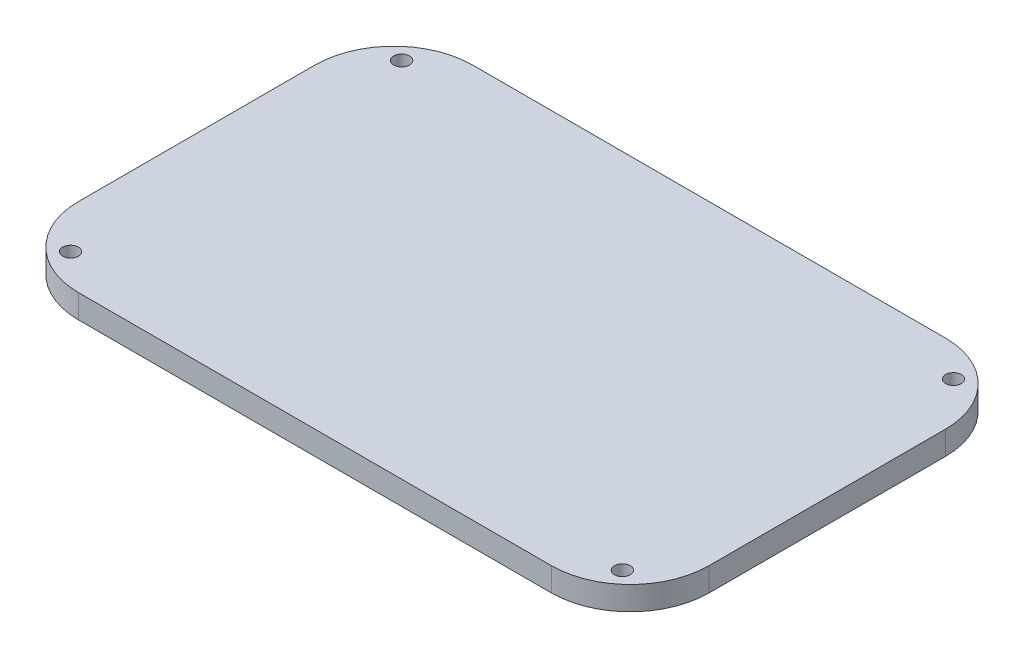
ISO-10303-21;
HEADER;
FILE_DESCRIPTION(('STEP AP214'),'2;1');
FILE_NAME('part.step','',(''),(''),'','','');
FILE_SCHEMA(('AUTOMOTIVE_DESIGN { 1 0 10303 214 1 1 1 1 }'));
ENDSEC;
DATA;
#1=APPLICATION_CONTEXT('core data for automotive mechanical design processes');
#2=APPLICATION_PROTOCOL_DEFINITION('international standard','automotive_design',2000,#1);
#3=PRODUCT_CONTEXT('',#1,'mechanical');
#4=PRODUCT('Part','Part','',(#3));
#5=PRODUCT_RELATED_PRODUCT_CATEGORY('part','',(#4));
#6=PRODUCT_DEFINITION_FORMATION('','',#4);
#7=PRODUCT_DEFINITION_CONTEXT('part definition',#1,'design');
#8=PRODUCT_DEFINITION('design','',#6,#7);
#9=PRODUCT_DEFINITION_SHAPE('','',#8);
#10=(LENGTH_UNIT() NAMED_UNIT(*) SI_UNIT(.MILLI.,.METRE.));
#11=(NAMED_UNIT(*) PLANE_ANGLE_UNIT() SI_UNIT($,.RADIAN.));
#12=(NAMED_UNIT(*) SI_UNIT($,.STERADIAN.) SOLID_ANGLE_UNIT());
#13=UNCERTAINTY_MEASURE_WITH_UNIT(LENGTH_MEASURE(1.E-05),#10,'distance_accuracy_value','');
#14=(GEOMETRIC_REPRESENTATION_CONTEXT(3) GLOBAL_UNCERTAINTY_ASSIGNED_CONTEXT((#13)) GLOBAL_UNIT_ASSIGNED_CONTEXT((#10,
#11,#12)) REPRESENTATION_CONTEXT('',''));
#15=CARTESIAN_POINT('',(0.,0.,0.));
#16=DIRECTION('',(0.,0.,1.));
#17=DIRECTION('',(1.,0.,0.));
#18=AXIS2_PLACEMENT_3D('',#15,#16,#17);
#19=CARTESIAN_POINT('',(-40.,3.,-25.));
#20=DIRECTION('',(1.,0.,0.));
#21=DIRECTION('',(0.,0.,-1.));
#22=AXIS2_PLACEMENT_3D('',#19,#20,#21);
#23=PLANE('',#22);
#24=DIRECTION('',(0.,0.,1.));
#25=VECTOR('',#24,1.);
#26=CARTESIAN_POINT('',(-40.,3.,-25.));
#27=LINE('',#26,#25);
#28=CARTESIAN_POINT('',(-40.,3.,-15.));
#29=VERTEX_POINT('',#28);
#30=CARTESIAN_POINT('',(-40.,3.,15.));
#31=VERTEX_POINT('',#30);
#32=EDGE_CURVE('E127',#29,#31,#27,.T.);
#33=ORIENTED_EDGE('',*,*,#32,.F.);
#34=DIRECTION('',(0.,-1.,0.));
#35=VECTOR('',#34,1.);
#36=CARTESIAN_POINT('',(-40.,3.,-15.));
#37=LINE('',#36,#35);
#38=CARTESIAN_POINT('',(-40.,0.,-15.));
#39=VERTEX_POINT('',#38);
#40=EDGE_CURVE('E112',#29,#39,#37,.T.);
#41=ORIENTED_EDGE('',*,*,#40,.T.);
#42=DIRECTION('',(0.,0.,1.));
#43=VECTOR('',#42,1.);
#44=CARTESIAN_POINT('',(-40.,0.,-25.));
#45=LINE('',#44,#43);
#46=CARTESIAN_POINT('',(-40.,0.,15.));
#47=VERTEX_POINT('',#46);
#48=EDGE_CURVE('E124',#39,#47,#45,.T.);
#49=ORIENTED_EDGE('',*,*,#48,.T.);
#50=DIRECTION('',(0.,-1.,0.));
#51=VECTOR('',#50,1.);
#52=CARTESIAN_POINT('',(-40.,3.,15.));
#53=LINE('',#52,#51);
#54=EDGE_CURVE('E126',#47,#31,#53,.F.);
#55=ORIENTED_EDGE('',*,*,#54,.T.);
#56=EDGE_LOOP('',(#33,#41,#49,#55));
#57=FACE_BOUND('',#56,.T.);
#58=ADVANCED_FACE('F39',(#57),#23,.F.);
#59=CARTESIAN_POINT('',(40.,3.,25.));
#60=DIRECTION('',(0.,0.,-1.));
#61=DIRECTION('',(-1.,0.,0.));
#62=AXIS2_PLACEMENT_3D('',#59,#60,#61);
#63=PLANE('',#62);
#64=DIRECTION('',(1.,0.,0.));
#65=VECTOR('',#64,1.);
#66=CARTESIAN_POINT('',(40.,0.,25.));
#67=LINE('',#66,#65);
#68=CARTESIAN_POINT('',(-30.,0.,25.));
#69=VERTEX_POINT('',#68);
#70=CARTESIAN_POINT('',(30.,0.,25.));
#71=VERTEX_POINT('',#70);
#72=EDGE_CURVE('E135',#69,#71,#67,.T.);
#73=ORIENTED_EDGE('',*,*,#72,.T.);
#74=DIRECTION('',(0.,-1.,0.));
#75=VECTOR('',#74,1.);
#76=CARTESIAN_POINT('',(30.,3.,25.));
#77=LINE('',#76,#75);
#78=CARTESIAN_POINT('',(30.,3.,25.));
#79=VERTEX_POINT('',#78);
#80=EDGE_CURVE('E11',#71,#79,#77,.F.);
#81=ORIENTED_EDGE('',*,*,#80,.T.);
#82=DIRECTION('',(1.,0.,0.));
#83=VECTOR('',#82,1.);
#84=CARTESIAN_POINT('',(40.,3.,25.));
#85=LINE('',#84,#83);
#86=CARTESIAN_POINT('',(-30.,3.,25.));
#87=VERTEX_POINT('',#86);
#88=EDGE_CURVE('E206',#87,#79,#85,.T.);
#89=ORIENTED_EDGE('',*,*,#88,.F.);
#90=DIRECTION('',(0.,-1.,0.));
#91=VECTOR('',#90,1.);
#92=CARTESIAN_POINT('',(-30.,3.,25.));
#93=LINE('',#92,#91);
#94=EDGE_CURVE('E48',#87,#69,#93,.T.);
#95=ORIENTED_EDGE('',*,*,#94,.T.);
#96=EDGE_LOOP('',(#73,#81,#89,#95));
#97=FACE_BOUND('',#96,.T.);
#98=ADVANCED_FACE('F224',(#97),#63,.F.);
#99=CARTESIAN_POINT('',(40.,3.,-25.));
#100=DIRECTION('',(-1.,0.,0.));
#101=DIRECTION('',(0.,0.,1.));
#102=AXIS2_PLACEMENT_3D('',#99,#100,#101);
#103=PLANE('',#102);
#104=DIRECTION('',(0.,0.,-1.));
#105=VECTOR('',#104,1.);
#106=CARTESIAN_POINT('',(40.,0.,-25.));
#107=LINE('',#106,#105);
#108=CARTESIAN_POINT('',(40.,0.,15.));
#109=VERTEX_POINT('',#108);
#110=CARTESIAN_POINT('',(40.,0.,-15.));
#111=VERTEX_POINT('',#110);
#112=EDGE_CURVE('E134',#109,#111,#107,.T.);
#113=ORIENTED_EDGE('',*,*,#112,.T.);
#114=DIRECTION('',(0.,-1.,0.));
#115=VECTOR('',#114,1.);
#116=CARTESIAN_POINT('',(40.,3.,-15.));
#117=LINE('',#116,#115);
#118=CARTESIAN_POINT('',(40.,3.,-15.));
#119=VERTEX_POINT('',#118);
#120=EDGE_CURVE('E57',#111,#119,#117,.F.);
#121=ORIENTED_EDGE('',*,*,#120,.T.);
#122=DIRECTION('',(0.,0.,-1.));
#123=VECTOR('',#122,1.);
#124=CARTESIAN_POINT('',(40.,3.,-25.));
#125=LINE('',#124,#123);
#126=CARTESIAN_POINT('',(40.,3.,15.));
#127=VERTEX_POINT('',#126);
#128=EDGE_CURVE('E210',#127,#119,#125,.T.);
#129=ORIENTED_EDGE('',*,*,#128,.F.);
#130=DIRECTION('',(0.,-1.,0.));
#131=VECTOR('',#130,1.);
#132=CARTESIAN_POINT('',(40.,3.,15.));
#133=LINE('',#132,#131);
#134=EDGE_CURVE('E161',#127,#109,#133,.T.);
#135=ORIENTED_EDGE('',*,*,#134,.T.);
#136=EDGE_LOOP('',(#113,#121,#129,#135));
#137=FACE_BOUND('',#136,.T.);
#138=ADVANCED_FACE('F220',(#137),#103,.F.);
#139=CARTESIAN_POINT('',(40.,3.,-25.));
#140=DIRECTION('',(0.,0.,1.));
#141=DIRECTION('',(1.,0.,0.));
#142=AXIS2_PLACEMENT_3D('',#139,#140,#141);
#143=PLANE('',#142);
#144=DIRECTION('',(-1.,0.,0.));
#145=VECTOR('',#144,1.);
#146=CARTESIAN_POINT('',(40.,0.,-25.));
#147=LINE('',#146,#145);
#148=CARTESIAN_POINT('',(30.,0.,-25.));
#149=VERTEX_POINT('',#148);
#150=CARTESIAN_POINT('',(-30.,0.,-25.));
#151=VERTEX_POINT('',#150);
#152=EDGE_CURVE('E145',#149,#151,#147,.T.);
#153=ORIENTED_EDGE('',*,*,#152,.T.);
#154=DIRECTION('',(0.,-1.,0.));
#155=VECTOR('',#154,1.);
#156=CARTESIAN_POINT('',(-30.,3.,-25.));
#157=LINE('',#156,#155);
#158=CARTESIAN_POINT('',(-30.,3.,-25.));
#159=VERTEX_POINT('',#158);
#160=EDGE_CURVE('E115',#151,#159,#157,.F.);
#161=ORIENTED_EDGE('',*,*,#160,.T.);
#162=DIRECTION('',(-1.,0.,0.));
#163=VECTOR('',#162,1.);
#164=CARTESIAN_POINT('',(40.,3.,-25.));
#165=LINE('',#164,#163);
#166=CARTESIAN_POINT('',(30.,3.,-25.));
#167=VERTEX_POINT('',#166);
#168=EDGE_CURVE('E140',#167,#159,#165,.T.);
#169=ORIENTED_EDGE('',*,*,#168,.F.);
#170=DIRECTION('',(0.,-1.,0.));
#171=VECTOR('',#170,1.);
#172=CARTESIAN_POINT('',(30.,3.,-25.));
#173=LINE('',#172,#171);
#174=EDGE_CURVE('E120',#167,#149,#173,.T.);
#175=ORIENTED_EDGE('',*,*,#174,.T.);
#176=EDGE_LOOP('',(#153,#161,#169,#175));
#177=FACE_BOUND('',#176,.T.);
#178=ADVANCED_FACE('F213',(#177),#143,.F.);
#179=CARTESIAN_POINT('',(0.,3.,0.));
#180=DIRECTION('',(0.,-1.,0.));
#181=DIRECTION('',(0.,0.,-1.));
#182=AXIS2_PLACEMENT_3D('',#179,#180,#181);
#183=PLANE('',#182);
#184=CARTESIAN_POINT('',(-35.,3.,21.));
#185=DIRECTION('',(0.,1.,0.));
#186=DIRECTION('',(0.,0.,-1.));
#187=AXIS2_PLACEMENT_3D('',#184,#185,#186);
#188=CIRCLE('',#187,0.999999999999998);
#189=CARTESIAN_POINT('',(-35.,3.,20.));
#190=VERTEX_POINT('',#189);
#191=EDGE_CURVE('E201',#190,#190,#188,.T.);
#192=ORIENTED_EDGE('',*,*,#191,.F.);
#193=EDGE_LOOP('',(#192));
#194=FACE_BOUND('',#193,.T.);
#195=CARTESIAN_POINT('',(35.,3.,21.));
#196=DIRECTION('',(0.,1.,0.));
#197=DIRECTION('',(0.,0.,1.));
#198=AXIS2_PLACEMENT_3D('',#195,#196,#197);
#199=CIRCLE('',#198,0.999999999999998);
#200=CARTESIAN_POINT('',(35.,3.,22.));
#201=VERTEX_POINT('',#200);
#202=EDGE_CURVE('E200',#201,#201,#199,.T.);
#203=ORIENTED_EDGE('',*,*,#202,.F.);
#204=EDGE_LOOP('',(#203));
#205=FACE_BOUND('',#204,.T.);
#206=CARTESIAN_POINT('',(35.,3.,-21.));
#207=DIRECTION('',(0.,1.,0.));
#208=DIRECTION('',(0.,0.,-1.));
#209=AXIS2_PLACEMENT_3D('',#206,#207,#208);
#210=CIRCLE('',#209,0.999999999999998);
#211=CARTESIAN_POINT('',(35.,3.,-22.));
#212=VERTEX_POINT('',#211);
#213=EDGE_CURVE('E198',#212,#212,#210,.T.);
#214=ORIENTED_EDGE('',*,*,#213,.F.);
#215=EDGE_LOOP('',(#214));
#216=FACE_BOUND('',#215,.T.);
#217=CARTESIAN_POINT('',(-35.,3.,-21.));
#218=DIRECTION('',(0.,1.,0.));
#219=DIRECTION('',(0.,0.,1.));
#220=AXIS2_PLACEMENT_3D('',#217,#218,#219);
#221=CIRCLE('',#220,0.999999999999998);
#222=CARTESIAN_POINT('',(-35.,3.,-20.));
#223=VERTEX_POINT('',#222);
#224=EDGE_CURVE('E171',#223,#223,#221,.T.);
#225=ORIENTED_EDGE('',*,*,#224,.F.);
#226=EDGE_LOOP('',(#225));
#227=FACE_BOUND('',#226,.T.);
#228=ORIENTED_EDGE('',*,*,#168,.T.);
#229=CARTESIAN_POINT('',(-30.,3.,-15.));
#230=DIRECTION('',(0.,-1.,0.));
#231=DIRECTION('',(0.,0.,-1.));
#232=AXIS2_PLACEMENT_3D('',#229,#230,#231);
#233=CIRCLE('',#232,10.);
#234=EDGE_CURVE('E157',#159,#29,#233,.F.);
#235=ORIENTED_EDGE('',*,*,#234,.T.);
#236=ORIENTED_EDGE('',*,*,#32,.T.);
#237=CARTESIAN_POINT('',(-30.,3.,15.));
#238=DIRECTION('',(0.,-1.,0.));
#239=DIRECTION('',(0.,0.,-1.));
#240=AXIS2_PLACEMENT_3D('',#237,#238,#239);
#241=CIRCLE('',#240,10.);
#242=EDGE_CURVE('E152',#31,#87,#241,.F.);
#243=ORIENTED_EDGE('',*,*,#242,.T.);
#244=ORIENTED_EDGE('',*,*,#88,.T.);
#245=CARTESIAN_POINT('',(30.,3.,15.));
#246=DIRECTION('',(0.,-1.,0.));
#247=DIRECTION('',(0.,0.,-1.));
#248=AXIS2_PLACEMENT_3D('',#245,#246,#247);
#249=CIRCLE('',#248,10.);
#250=EDGE_CURVE('E62',#79,#127,#249,.F.);
#251=ORIENTED_EDGE('',*,*,#250,.T.);
#252=ORIENTED_EDGE('',*,*,#128,.T.);
#253=CARTESIAN_POINT('',(30.,3.,-15.));
#254=DIRECTION('',(0.,-1.,0.));
#255=DIRECTION('',(0.,0.,-1.));
#256=AXIS2_PLACEMENT_3D('',#253,#254,#255);
#257=CIRCLE('',#256,10.);
#258=EDGE_CURVE('E160',#119,#167,#257,.F.);
#259=ORIENTED_EDGE('',*,*,#258,.T.);
#260=EDGE_LOOP('',(#228,#235,#236,#243,#244,#251,#252,#259));
#261=FACE_BOUND('',#260,.T.);
#262=ADVANCED_FACE('F182',(#194,#205,#216,#227,#261),#183,.F.);
#263=CARTESIAN_POINT('',(0.,0.,0.));
#264=DIRECTION('',(0.,-1.,0.));
#265=DIRECTION('',(0.,0.,-1.));
#266=AXIS2_PLACEMENT_3D('',#263,#264,#265);
#267=PLANE('',#266);
#268=CARTESIAN_POINT('',(-35.,0.,21.));
#269=DIRECTION('',(0.,-1.,0.));
#270=DIRECTION('',(0.,0.,-1.));
#271=AXIS2_PLACEMENT_3D('',#268,#269,#270);
#272=CIRCLE('',#271,0.999999999999998);
#273=CARTESIAN_POINT('',(-35.,0.,20.));
#274=VERTEX_POINT('',#273);
#275=EDGE_CURVE('E43',#274,#274,#272,.T.);
#276=ORIENTED_EDGE('',*,*,#275,.F.);
#277=EDGE_LOOP('',(#276));
#278=FACE_BOUND('',#277,.T.);
#279=CARTESIAN_POINT('',(35.,0.,21.));
#280=DIRECTION('',(0.,-1.,0.));
#281=DIRECTION('',(0.,0.,-1.));
#282=AXIS2_PLACEMENT_3D('',#279,#280,#281);
#283=CIRCLE('',#282,0.999999999999998);
#284=CARTESIAN_POINT('',(35.,0.,20.));
#285=VERTEX_POINT('',#284);
#286=EDGE_CURVE('E139',#285,#285,#283,.T.);
#287=ORIENTED_EDGE('',*,*,#286,.F.);
#288=EDGE_LOOP('',(#287));
#289=FACE_BOUND('',#288,.T.);
#290=CARTESIAN_POINT('',(35.,0.,-21.));
#291=DIRECTION('',(0.,-1.,0.));
#292=DIRECTION('',(0.,0.,-1.));
#293=AXIS2_PLACEMENT_3D('',#290,#291,#292);
#294=CIRCLE('',#293,0.999999999999998);
#295=CARTESIAN_POINT('',(35.,0.,-22.));
#296=VERTEX_POINT('',#295);
#297=EDGE_CURVE('E168',#296,#296,#294,.T.);
#298=ORIENTED_EDGE('',*,*,#297,.F.);
#299=EDGE_LOOP('',(#298));
#300=FACE_BOUND('',#299,.T.);
#301=CARTESIAN_POINT('',(-35.,0.,-21.));
#302=DIRECTION('',(0.,-1.,0.));
#303=DIRECTION('',(0.,0.,-1.));
#304=AXIS2_PLACEMENT_3D('',#301,#302,#303);
#305=CIRCLE('',#304,0.999999999999998);
#306=CARTESIAN_POINT('',(-35.,0.,-22.));
#307=VERTEX_POINT('',#306);
#308=EDGE_CURVE('E170',#307,#307,#305,.T.);
#309=ORIENTED_EDGE('',*,*,#308,.F.);
#310=EDGE_LOOP('',(#309));
#311=FACE_BOUND('',#310,.T.);
#312=ORIENTED_EDGE('',*,*,#48,.F.);
#313=CARTESIAN_POINT('',(-30.,0.,-15.));
#314=DIRECTION('',(0.,-1.,0.));
#315=DIRECTION('',(0.,0.,-1.));
#316=AXIS2_PLACEMENT_3D('',#313,#314,#315);
#317=CIRCLE('',#316,10.);
#318=EDGE_CURVE('E110',#39,#151,#317,.T.);
#319=ORIENTED_EDGE('',*,*,#318,.T.);
#320=ORIENTED_EDGE('',*,*,#152,.F.);
#321=CARTESIAN_POINT('',(30.,0.,-15.));
#322=DIRECTION('',(0.,-1.,0.));
#323=DIRECTION('',(0.,0.,-1.));
#324=AXIS2_PLACEMENT_3D('',#321,#322,#323);
#325=CIRCLE('',#324,10.);
#326=EDGE_CURVE('E117',#149,#111,#325,.T.);
#327=ORIENTED_EDGE('',*,*,#326,.T.);
#328=ORIENTED_EDGE('',*,*,#112,.F.);
#329=CARTESIAN_POINT('',(30.,0.,15.));
#330=DIRECTION('',(0.,-1.,0.));
#331=DIRECTION('',(0.,0.,-1.));
#332=AXIS2_PLACEMENT_3D('',#329,#330,#331);
#333=CIRCLE('',#332,10.);
#334=EDGE_CURVE('E146',#109,#71,#333,.T.);
#335=ORIENTED_EDGE('',*,*,#334,.T.);
#336=ORIENTED_EDGE('',*,*,#72,.F.);
#337=CARTESIAN_POINT('',(-30.,0.,15.));
#338=DIRECTION('',(0.,-1.,0.));
#339=DIRECTION('',(0.,0.,-1.));
#340=AXIS2_PLACEMENT_3D('',#337,#338,#339);
#341=CIRCLE('',#340,10.);
#342=EDGE_CURVE('E130',#69,#47,#341,.T.);
#343=ORIENTED_EDGE('',*,*,#342,.T.);
#344=EDGE_LOOP('',(#312,#319,#320,#327,#328,#335,#336,#343));
#345=FACE_BOUND('',#344,.T.);
#346=ADVANCED_FACE('F128',(#278,#289,#300,#311,#345),#267,.T.);
#347=CARTESIAN_POINT('',(-30.,3.,-15.));
#348=DIRECTION('',(0.,-1.,0.));
#349=DIRECTION('',(0.,0.,-1.));
#350=AXIS2_PLACEMENT_3D('',#347,#348,#349);
#351=CYLINDRICAL_SURFACE('',#350,10.);
#352=ORIENTED_EDGE('',*,*,#234,.F.);
#353=ORIENTED_EDGE('',*,*,#160,.F.);
#354=ORIENTED_EDGE('',*,*,#318,.F.);
#355=ORIENTED_EDGE('',*,*,#40,.F.);
#356=EDGE_LOOP('',(#352,#353,#354,#355));
#357=FACE_BOUND('',#356,.T.);
#358=ADVANCED_FACE('F109',(#357),#351,.T.);
#359=CARTESIAN_POINT('',(30.,3.,-15.));
#360=DIRECTION('',(0.,-1.,0.));
#361=DIRECTION('',(0.,0.,-1.));
#362=AXIS2_PLACEMENT_3D('',#359,#360,#361);
#363=CYLINDRICAL_SURFACE('',#362,10.);
#364=ORIENTED_EDGE('',*,*,#258,.F.);
#365=ORIENTED_EDGE('',*,*,#120,.F.);
#366=ORIENTED_EDGE('',*,*,#326,.F.);
#367=ORIENTED_EDGE('',*,*,#174,.F.);
#368=EDGE_LOOP('',(#364,#365,#366,#367));
#369=FACE_BOUND('',#368,.T.);
#370=ADVANCED_FACE('F214',(#369),#363,.T.);
#371=CARTESIAN_POINT('',(30.,3.,15.));
#372=DIRECTION('',(0.,-1.,0.));
#373=DIRECTION('',(0.,0.,-1.));
#374=AXIS2_PLACEMENT_3D('',#371,#372,#373);
#375=CYLINDRICAL_SURFACE('',#374,10.);
#376=ORIENTED_EDGE('',*,*,#250,.F.);
#377=ORIENTED_EDGE('',*,*,#80,.F.);
#378=ORIENTED_EDGE('',*,*,#334,.F.);
#379=ORIENTED_EDGE('',*,*,#134,.F.);
#380=EDGE_LOOP('',(#376,#377,#378,#379));
#381=FACE_BOUND('',#380,.T.);
#382=ADVANCED_FACE('F219',(#381),#375,.T.);
#383=CARTESIAN_POINT('',(-30.,3.,15.));
#384=DIRECTION('',(0.,-1.,0.));
#385=DIRECTION('',(0.,0.,-1.));
#386=AXIS2_PLACEMENT_3D('',#383,#384,#385);
#387=CYLINDRICAL_SURFACE('',#386,10.);
#388=ORIENTED_EDGE('',*,*,#242,.F.);
#389=ORIENTED_EDGE('',*,*,#54,.F.);
#390=ORIENTED_EDGE('',*,*,#342,.F.);
#391=ORIENTED_EDGE('',*,*,#94,.F.);
#392=EDGE_LOOP('',(#388,#389,#390,#391));
#393=FACE_BOUND('',#392,.T.);
#394=ADVANCED_FACE('F41',(#393),#387,.T.);
#395=CARTESIAN_POINT('',(-35.,-2.,-21.));
#396=DIRECTION('',(0.,1.,0.));
#397=DIRECTION('',(0.,0.,1.));
#398=AXIS2_PLACEMENT_3D('',#395,#396,#397);
#399=CYLINDRICAL_SURFACE('',#398,0.999999999999998);
#400=ORIENTED_EDGE('',*,*,#308,.T.);
#401=EDGE_LOOP('',(#400));
#402=FACE_BOUND('',#401,.T.);
#403=ORIENTED_EDGE('',*,*,#224,.T.);
#404=EDGE_LOOP('',(#403));
#405=FACE_BOUND('',#404,.T.);
#406=ADVANCED_FACE('F187',(#402,#405),#399,.F.);
#407=CARTESIAN_POINT('',(35.,-2.,-21.));
#408=DIRECTION('',(0.,1.,0.));
#409=DIRECTION('',(0.,0.,1.));
#410=AXIS2_PLACEMENT_3D('',#407,#408,#409);
#411=CYLINDRICAL_SURFACE('',#410,0.999999999999998);
#412=ORIENTED_EDGE('',*,*,#297,.T.);
#413=EDGE_LOOP('',(#412));
#414=FACE_BOUND('',#413,.T.);
#415=ORIENTED_EDGE('',*,*,#213,.T.);
#416=EDGE_LOOP('',(#415));
#417=FACE_BOUND('',#416,.T.);
#418=ADVANCED_FACE('F191',(#414,#417),#411,.F.);
#419=CARTESIAN_POINT('',(35.,-2.,21.));
#420=DIRECTION('',(0.,1.,0.));
#421=DIRECTION('',(0.,0.,1.));
#422=AXIS2_PLACEMENT_3D('',#419,#420,#421);
#423=CYLINDRICAL_SURFACE('',#422,0.999999999999998);
#424=ORIENTED_EDGE('',*,*,#286,.T.);
#425=EDGE_LOOP('',(#424));
#426=FACE_BOUND('',#425,.T.);
#427=ORIENTED_EDGE('',*,*,#202,.T.);
#428=EDGE_LOOP('',(#427));
#429=FACE_BOUND('',#428,.T.);
#430=ADVANCED_FACE('F176',(#426,#429),#423,.F.);
#431=CARTESIAN_POINT('',(-35.,-2.,21.));
#432=DIRECTION('',(0.,1.,0.));
#433=DIRECTION('',(0.,0.,1.));
#434=AXIS2_PLACEMENT_3D('',#431,#432,#433);
#435=CYLINDRICAL_SURFACE('',#434,0.999999999999998);
#436=ORIENTED_EDGE('',*,*,#275,.T.);
#437=EDGE_LOOP('',(#436));
#438=FACE_BOUND('',#437,.T.);
#439=ORIENTED_EDGE('',*,*,#191,.T.);
#440=EDGE_LOOP('',(#439));
#441=FACE_BOUND('',#440,.T.);
#442=ADVANCED_FACE('F282',(#438,#441),#435,.F.);
#443=CLOSED_SHELL('',(#58,#98,#138,#178,#262,#346,#358,#370,#382,#394,#406,#418,#430,#442));
#444=MANIFOLD_SOLID_BREP('B2',#443);
#445=ADVANCED_BREP_SHAPE_REPRESENTATION('',(#18,#444),#14);
#446=SHAPE_DEFINITION_REPRESENTATION(#9,#445);
ENDSEC;
END-ISO-10303-21;
